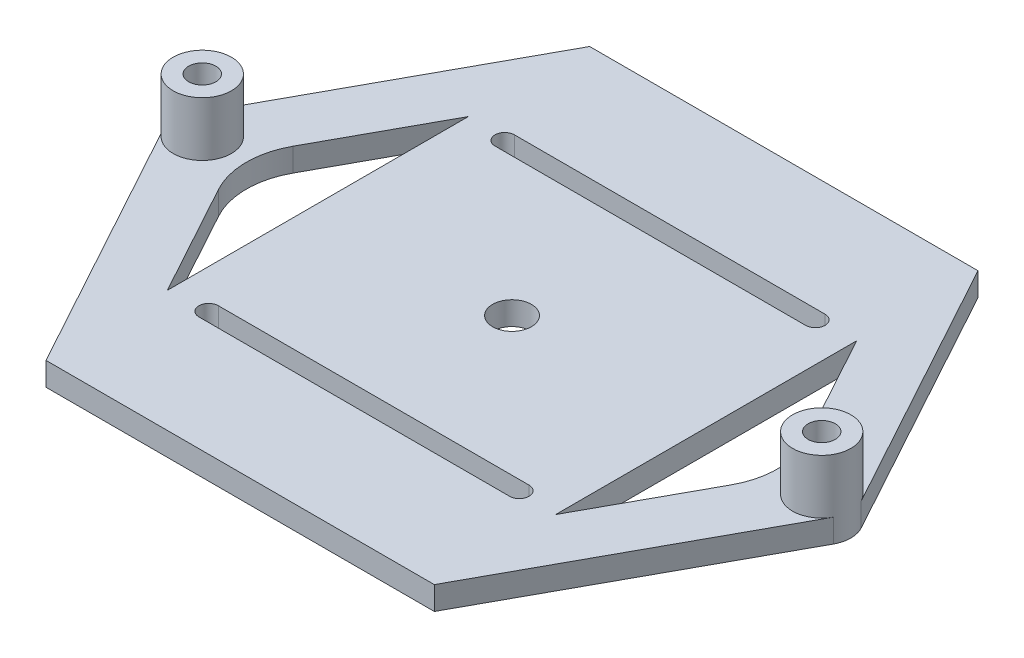
ISO-10303-21;
HEADER;
FILE_DESCRIPTION(('STEP AP214'),'2;1');
FILE_NAME('part.step','',(''),(''),'','','');
FILE_SCHEMA(('AUTOMOTIVE_DESIGN { 1 0 10303 214 1 1 1 1 }'));
ENDSEC;
DATA;
#1=APPLICATION_CONTEXT('core data for automotive mechanical design processes');
#2=APPLICATION_PROTOCOL_DEFINITION('international standard','automotive_design',2000,#1);
#3=PRODUCT_CONTEXT('',#1,'mechanical');
#4=PRODUCT('Part','Part','',(#3));
#5=PRODUCT_RELATED_PRODUCT_CATEGORY('part','',(#4));
#6=PRODUCT_DEFINITION_FORMATION('','',#4);
#7=PRODUCT_DEFINITION_CONTEXT('part definition',#1,'design');
#8=PRODUCT_DEFINITION('design','',#6,#7);
#9=PRODUCT_DEFINITION_SHAPE('','',#8);
#10=(LENGTH_UNIT() NAMED_UNIT(*) SI_UNIT(.MILLI.,.METRE.));
#11=(NAMED_UNIT(*) PLANE_ANGLE_UNIT() SI_UNIT($,.RADIAN.));
#12=(NAMED_UNIT(*) SI_UNIT($,.STERADIAN.) SOLID_ANGLE_UNIT());
#13=UNCERTAINTY_MEASURE_WITH_UNIT(LENGTH_MEASURE(1.E-05),#10,'distance_accuracy_value','');
#14=(GEOMETRIC_REPRESENTATION_CONTEXT(3) GLOBAL_UNCERTAINTY_ASSIGNED_CONTEXT((#13)) GLOBAL_UNIT_ASSIGNED_CONTEXT((#10,
#11,#12)) REPRESENTATION_CONTEXT('',''));
#15=CARTESIAN_POINT('',(0.,0.,0.));
#16=DIRECTION('',(0.,0.,1.));
#17=DIRECTION('',(1.,0.,0.));
#18=AXIS2_PLACEMENT_3D('',#15,#16,#17);
#19=CARTESIAN_POINT('',(-39.8762558433018,-110.2,0.));
#20=DIRECTION('',(0.,1.,0.));
#21=DIRECTION('',(0.,0.,1.));
#22=AXIS2_PLACEMENT_3D('',#19,#20,#21);
#23=CYLINDRICAL_SURFACE('',#22,3.75000000000001);
#24=CARTESIAN_POINT('',(-39.8762558433018,-100.2,0.));
#25=DIRECTION('',(0.,-1.,0.));
#26=DIRECTION('',(0.,0.,-1.));
#27=AXIS2_PLACEMENT_3D('',#24,#25,#26);
#28=CIRCLE('',#27,3.75000000000001);
#29=CARTESIAN_POINT('',(-39.8762558433018,-100.2,-3.75000000000001));
#30=VERTEX_POINT('',#29);
#31=EDGE_CURVE('E49',#30,#30,#28,.T.);
#32=ORIENTED_EDGE('',*,*,#31,.T.);
#33=EDGE_LOOP('',(#32));
#34=FACE_BOUND('',#33,.T.);
#35=DIRECTION('',(0.,-1.,0.));
#36=VECTOR('',#35,1.);
#37=CARTESIAN_POINT('',(-43.1659902962379,-107.2,1.80004089652578));
#38=LINE('',#37,#36);
#39=CARTESIAN_POINT('',(-43.1659902962379,-107.2,1.80004089652578));
#40=VERTEX_POINT('',#39);
#41=CARTESIAN_POINT('',(-43.1659902962379,-110.2,1.80004089652577));
#42=VERTEX_POINT('',#41);
#43=EDGE_CURVE('E466',#40,#42,#38,.T.);
#44=ORIENTED_EDGE('',*,*,#43,.F.);
#45=CARTESIAN_POINT('',(-39.8762558433018,-107.2,0.));
#46=DIRECTION('',(0.,-1.,0.));
#47=DIRECTION('',(0.,0.,-1.));
#48=AXIS2_PLACEMENT_3D('',#45,#46,#47);
#49=CIRCLE('',#48,3.75000000000001);
#50=CARTESIAN_POINT('',(-43.1659902962379,-107.2,-1.80004089652577));
#51=VERTEX_POINT('',#50);
#52=EDGE_CURVE('E356',#51,#40,#49,.T.);
#53=ORIENTED_EDGE('',*,*,#52,.F.);
#54=DIRECTION('',(0.,-1.,0.));
#55=VECTOR('',#54,1.);
#56=CARTESIAN_POINT('',(-43.1659902962379,-107.2,-1.80004089652577));
#57=LINE('',#56,#55);
#58=CARTESIAN_POINT('',(-43.1659902962379,-110.2,-1.80004089652577));
#59=VERTEX_POINT('',#58);
#60=EDGE_CURVE('E463',#51,#59,#57,.T.);
#61=ORIENTED_EDGE('',*,*,#60,.T.);
#62=CARTESIAN_POINT('',(-39.8762558433018,-110.2,0.));
#63=DIRECTION('',(0.,-1.,0.));
#64=DIRECTION('',(0.,0.,-1.));
#65=AXIS2_PLACEMENT_3D('',#62,#63,#64);
#66=CIRCLE('',#65,3.75000000000001);
#67=EDGE_CURVE('E11',#42,#59,#66,.T.);
#68=ORIENTED_EDGE('',*,*,#67,.F.);
#69=EDGE_LOOP('',(#44,#53,#61,#68));
#70=FACE_BOUND('',#69,.T.);
#71=ADVANCED_FACE('F50',(#34,#70),#23,.T.);
#72=CARTESIAN_POINT('',(-39.8762558433018,-110.2,0.));
#73=DIRECTION('',(0.,-1.,0.));
#74=DIRECTION('',(0.,0.,-1.));
#75=AXIS2_PLACEMENT_3D('',#72,#73,#74);
#76=PLANE('',#75);
#77=CARTESIAN_POINT('',(20.,-110.2,-19.0579297849978));
#78=DIRECTION('',(0.,1.,0.));
#79=DIRECTION('',(0.,0.,-1.));
#80=AXIS2_PLACEMENT_3D('',#77,#78,#79);
#81=CIRCLE('',#80,1.25);
#82=CARTESIAN_POINT('',(20.,-110.2,-17.8079297849977));
#83=VERTEX_POINT('',#82);
#84=CARTESIAN_POINT('',(20.,-110.2,-20.3079297849978));
#85=VERTEX_POINT('',#84);
#86=EDGE_CURVE('E215',#83,#85,#81,.T.);
#87=ORIENTED_EDGE('',*,*,#86,.T.);
#88=DIRECTION('',(-1.,0.,0.));
#89=VECTOR('',#88,1.);
#90=CARTESIAN_POINT('',(20.,-110.2,-20.3079297849978));
#91=LINE('',#90,#89);
#92=CARTESIAN_POINT('',(-20.,-110.2,-20.3079297849978));
#93=VERTEX_POINT('',#92);
#94=EDGE_CURVE('E221',#85,#93,#91,.T.);
#95=ORIENTED_EDGE('',*,*,#94,.T.);
#96=CARTESIAN_POINT('',(-20.,-110.2,-19.0579297849978));
#97=DIRECTION('',(0.,1.,0.));
#98=DIRECTION('',(0.,0.,1.));
#99=AXIS2_PLACEMENT_3D('',#96,#97,#98);
#100=CIRCLE('',#99,1.25);
#101=CARTESIAN_POINT('',(-20.,-110.2,-17.8079297849978));
#102=VERTEX_POINT('',#101);
#103=EDGE_CURVE('E65',#93,#102,#100,.T.);
#104=ORIENTED_EDGE('',*,*,#103,.T.);
#105=DIRECTION('',(1.,0.,0.));
#106=VECTOR('',#105,1.);
#107=CARTESIAN_POINT('',(20.,-110.2,-17.8079297849977));
#108=LINE('',#107,#106);
#109=EDGE_CURVE('E222',#102,#83,#108,.T.);
#110=ORIENTED_EDGE('',*,*,#109,.T.);
#111=EDGE_LOOP('',(#87,#95,#104,#110));
#112=FACE_BOUND('',#111,.T.);
#113=CARTESIAN_POINT('',(20.,-110.2,19.0579297849978));
#114=DIRECTION('',(0.,1.,0.));
#115=DIRECTION('',(0.,0.,1.));
#116=AXIS2_PLACEMENT_3D('',#113,#114,#115);
#117=CIRCLE('',#116,1.25);
#118=CARTESIAN_POINT('',(20.,-110.2,20.3079297849978));
#119=VERTEX_POINT('',#118);
#120=CARTESIAN_POINT('',(20.,-110.2,17.8079297849978));
#121=VERTEX_POINT('',#120);
#122=EDGE_CURVE('E282',#119,#121,#117,.T.);
#123=ORIENTED_EDGE('',*,*,#122,.T.);
#124=DIRECTION('',(-1.,0.,0.));
#125=VECTOR('',#124,1.);
#126=CARTESIAN_POINT('',(20.,-110.2,17.8079297849978));
#127=LINE('',#126,#125);
#128=CARTESIAN_POINT('',(-20.,-110.2,17.8079297849978));
#129=VERTEX_POINT('',#128);
#130=EDGE_CURVE('E297',#121,#129,#127,.T.);
#131=ORIENTED_EDGE('',*,*,#130,.T.);
#132=CARTESIAN_POINT('',(-20.,-110.2,19.0579297849978));
#133=DIRECTION('',(0.,1.,0.));
#134=DIRECTION('',(0.,0.,-1.));
#135=AXIS2_PLACEMENT_3D('',#132,#133,#134);
#136=CIRCLE('',#135,1.25);
#137=CARTESIAN_POINT('',(-20.,-110.2,20.3079297849978));
#138=VERTEX_POINT('',#137);
#139=EDGE_CURVE('E69',#129,#138,#136,.T.);
#140=ORIENTED_EDGE('',*,*,#139,.T.);
#141=DIRECTION('',(1.,0.,0.));
#142=VECTOR('',#141,1.);
#143=CARTESIAN_POINT('',(20.,-110.2,20.3079297849978));
#144=LINE('',#143,#142);
#145=EDGE_CURVE('E266',#138,#119,#144,.T.);
#146=ORIENTED_EDGE('',*,*,#145,.T.);
#147=EDGE_LOOP('',(#123,#131,#140,#146));
#148=FACE_BOUND('',#147,.T.);
#149=CARTESIAN_POINT('',(0.,-110.2,0.));
#150=DIRECTION('',(0.,1.,0.));
#151=DIRECTION('',(0.,0.,1.));
#152=AXIS2_PLACEMENT_3D('',#149,#150,#151);
#153=CIRCLE('',#152,2.5);
#154=CARTESIAN_POINT('',(0.,-110.2,2.50000000000001));
#155=VERTEX_POINT('',#154);
#156=EDGE_CURVE('E301',#155,#155,#153,.T.);
#157=ORIENTED_EDGE('',*,*,#156,.T.);
#158=EDGE_LOOP('',(#157));
#159=FACE_BOUND('',#158,.T.);
#160=ORIENTED_EDGE('',*,*,#67,.T.);
#161=DIRECTION('',(-0.480010905740205,0.,0.877262520782957));
#162=VECTOR('',#161,1.);
#163=CARTESIAN_POINT('',(-33.9780834603154,-110.2,-18.5917558663577));
#164=LINE('',#163,#162);
#165=CARTESIAN_POINT('',(-25.,-110.2,-35.));
#166=VERTEX_POINT('',#165);
#167=EDGE_CURVE('E414',#166,#59,#164,.T.);
#168=ORIENTED_EDGE('',*,*,#167,.F.);
#169=DIRECTION('',(-1.,0.,0.));
#170=VECTOR('',#169,1.);
#171=CARTESIAN_POINT('',(0.,-110.2,-35.));
#172=LINE('',#171,#170);
#173=CARTESIAN_POINT('',(25.,-110.2,-35.));
#174=VERTEX_POINT('',#173);
#175=EDGE_CURVE('E420',#174,#166,#172,.T.);
#176=ORIENTED_EDGE('',*,*,#175,.F.);
#177=DIRECTION('',(0.480010905740205,0.,0.877262520782957));
#178=VECTOR('',#177,1.);
#179=CARTESIAN_POINT('',(33.9780834603154,-110.2,-18.5917558663577));
#180=LINE('',#179,#178);
#181=CARTESIAN_POINT('',(43.1659902962396,-110.2,-1.80004089652668));
#182=VERTEX_POINT('',#181);
#183=EDGE_CURVE('E425',#174,#182,#180,.T.);
#184=ORIENTED_EDGE('',*,*,#183,.T.);
#185=CARTESIAN_POINT('',(39.8762558433018,-110.2,0.));
#186=DIRECTION('',(0.,-1.,0.));
#187=DIRECTION('',(0.,0.,1.));
#188=AXIS2_PLACEMENT_3D('',#185,#186,#187);
#189=CIRCLE('',#188,3.75000000000192);
#190=CARTESIAN_POINT('',(43.1659902962396,-110.2,1.8000408965267));
#191=VERTEX_POINT('',#190);
#192=EDGE_CURVE('E307',#182,#191,#189,.T.);
#193=ORIENTED_EDGE('',*,*,#192,.T.);
#194=DIRECTION('',(0.480010905740205,0.,-0.877262520782957));
#195=VECTOR('',#194,1.);
#196=CARTESIAN_POINT('',(33.9780834603154,-110.2,18.5917558663577));
#197=LINE('',#196,#195);
#198=CARTESIAN_POINT('',(25.,-110.2,35.));
#199=VERTEX_POINT('',#198);
#200=EDGE_CURVE('E401',#199,#191,#197,.T.);
#201=ORIENTED_EDGE('',*,*,#200,.F.);
#202=DIRECTION('',(-1.,0.,0.));
#203=VECTOR('',#202,1.);
#204=CARTESIAN_POINT('',(0.,-110.2,35.));
#205=LINE('',#204,#203);
#206=CARTESIAN_POINT('',(-25.,-110.2,35.));
#207=VERTEX_POINT('',#206);
#208=EDGE_CURVE('E410',#199,#207,#205,.T.);
#209=ORIENTED_EDGE('',*,*,#208,.T.);
#210=DIRECTION('',(-0.480010905740205,0.,-0.877262520782957));
#211=VECTOR('',#210,1.);
#212=CARTESIAN_POINT('',(-33.9780834603154,-110.2,18.5917558663577));
#213=LINE('',#212,#211);
#214=EDGE_CURVE('E413',#207,#42,#213,.T.);
#215=ORIENTED_EDGE('',*,*,#214,.T.);
#216=EDGE_LOOP('',(#160,#168,#176,#184,#193,#201,#209,#215));
#217=FACE_BOUND('',#216,.T.);
#218=CARTESIAN_POINT('',(-39.8762558433018,-110.2,0.));
#219=DIRECTION('',(0.,-1.,0.));
#220=DIRECTION('',(0.,0.,-1.));
#221=AXIS2_PLACEMENT_3D('',#218,#219,#220);
#222=CIRCLE('',#221,1.75);
#223=CARTESIAN_POINT('',(-39.8762558433018,-110.2,-1.75));
#224=VERTEX_POINT('',#223);
#225=EDGE_CURVE('E493',#224,#224,#222,.T.);
#226=ORIENTED_EDGE('',*,*,#225,.F.);
#227=EDGE_LOOP('',(#226));
#228=FACE_BOUND('',#227,.T.);
#229=CARTESIAN_POINT('',(-24.202498359934,-110.2,0.));
#230=DIRECTION('',(0.,-1.,0.));
#231=DIRECTION('',(0.,0.,-1.));
#232=AXIS2_PLACEMENT_3D('',#229,#230,#231);
#233=CIRCLE('',#232,10.);
#234=CARTESIAN_POINT('',(-32.9751235677635,-110.2,4.80010905740209));
#235=VERTEX_POINT('',#234);
#236=CARTESIAN_POINT('',(-32.9751235677635,-110.2,-4.80010905740209));
#237=VERTEX_POINT('',#236);
#238=EDGE_CURVE('E323',#235,#237,#233,.T.);
#239=ORIENTED_EDGE('',*,*,#238,.F.);
#240=DIRECTION('',(0.480010905740205,0.,0.877262520782957));
#241=VECTOR('',#240,1.);
#242=CARTESIAN_POINT('',(-27.3986145544432,-110.2,14.9916740733061));
#243=LINE('',#242,#241);
#244=CARTESIAN_POINT('',(-25.,-110.2,19.3753549964983));
#245=VERTEX_POINT('',#244);
#246=EDGE_CURVE('E395',#235,#245,#243,.T.);
#247=ORIENTED_EDGE('',*,*,#246,.T.);
#248=DIRECTION('',(0.,0.,1.));
#249=VECTOR('',#248,1.);
#250=CARTESIAN_POINT('',(-25.,-110.2,0.));
#251=LINE('',#250,#249);
#252=CARTESIAN_POINT('',(-25.,-110.2,-19.3753549964983));
#253=VERTEX_POINT('',#252);
#254=EDGE_CURVE('E398',#253,#245,#251,.T.);
#255=ORIENTED_EDGE('',*,*,#254,.F.);
#256=DIRECTION('',(0.480010905740205,0.,-0.877262520782957));
#257=VECTOR('',#256,1.);
#258=CARTESIAN_POINT('',(-27.3986145544432,-110.2,-14.9916740733061));
#259=LINE('',#258,#257);
#260=EDGE_CURVE('E399',#237,#253,#259,.T.);
#261=ORIENTED_EDGE('',*,*,#260,.F.);
#262=EDGE_LOOP('',(#239,#247,#255,#261));
#263=FACE_BOUND('',#262,.T.);
#264=DIRECTION('',(-0.480010905740205,0.,0.877262520782957));
#265=VECTOR('',#264,1.);
#266=CARTESIAN_POINT('',(27.3986145544432,-110.2,14.9916740733061));
#267=LINE('',#266,#265);
#268=CARTESIAN_POINT('',(32.9751235677635,-110.2,4.80010905740209));
#269=VERTEX_POINT('',#268);
#270=CARTESIAN_POINT('',(25.,-110.2,19.3753549964983));
#271=VERTEX_POINT('',#270);
#272=EDGE_CURVE('E426',#269,#271,#267,.T.);
#273=ORIENTED_EDGE('',*,*,#272,.F.);
#274=CARTESIAN_POINT('',(24.202498359934,-110.2,0.));
#275=DIRECTION('',(0.,-1.,0.));
#276=DIRECTION('',(0.,0.,-1.));
#277=AXIS2_PLACEMENT_3D('',#274,#275,#276);
#278=CIRCLE('',#277,10.);
#279=CARTESIAN_POINT('',(32.9751235677635,-110.2,-4.80010905740209));
#280=VERTEX_POINT('',#279);
#281=EDGE_CURVE('E429',#269,#280,#278,.F.);
#282=ORIENTED_EDGE('',*,*,#281,.T.);
#283=DIRECTION('',(-0.480010905740205,0.,-0.877262520782957));
#284=VECTOR('',#283,1.);
#285=CARTESIAN_POINT('',(27.3986145544432,-110.2,-14.9916740733061));
#286=LINE('',#285,#284);
#287=CARTESIAN_POINT('',(25.,-110.2,-19.3753549964983));
#288=VERTEX_POINT('',#287);
#289=EDGE_CURVE('E432',#280,#288,#286,.T.);
#290=ORIENTED_EDGE('',*,*,#289,.T.);
#291=DIRECTION('',(0.,0.,1.));
#292=VECTOR('',#291,1.);
#293=CARTESIAN_POINT('',(25.,-110.2,0.));
#294=LINE('',#293,#292);
#295=EDGE_CURVE('E335',#288,#271,#294,.T.);
#296=ORIENTED_EDGE('',*,*,#295,.T.);
#297=EDGE_LOOP('',(#273,#282,#290,#296));
#298=FACE_BOUND('',#297,.T.);
#299=CARTESIAN_POINT('',(39.8762558433018,-110.2,0.));
#300=DIRECTION('',(0.,-1.,0.));
#301=DIRECTION('',(0.,0.,1.));
#302=AXIS2_PLACEMENT_3D('',#299,#300,#301);
#303=CIRCLE('',#302,1.75000000000191);
#304=CARTESIAN_POINT('',(39.8762558433018,-110.2,1.75000000000193));
#305=VERTEX_POINT('',#304);
#306=EDGE_CURVE('E312',#305,#305,#303,.T.);
#307=ORIENTED_EDGE('',*,*,#306,.F.);
#308=EDGE_LOOP('',(#307));
#309=FACE_BOUND('',#308,.T.);
#310=ADVANCED_FACE('F226',(#112,#148,#159,#217,#228,#263,#298,#309),#76,.T.);
#311=CARTESIAN_POINT('',(-39.8762558433018,-100.2,0.));
#312=DIRECTION('',(0.,-1.,0.));
#313=DIRECTION('',(0.,0.,-1.));
#314=AXIS2_PLACEMENT_3D('',#311,#312,#313);
#315=PLANE('',#314);
#316=ORIENTED_EDGE('',*,*,#31,.F.);
#317=EDGE_LOOP('',(#316));
#318=FACE_BOUND('',#317,.T.);
#319=CARTESIAN_POINT('',(-39.8762558433018,-100.2,0.));
#320=DIRECTION('',(0.,-1.,0.));
#321=DIRECTION('',(0.,0.,-1.));
#322=AXIS2_PLACEMENT_3D('',#319,#320,#321);
#323=CIRCLE('',#322,1.75);
#324=CARTESIAN_POINT('',(-39.8762558433018,-100.2,-1.75));
#325=VERTEX_POINT('',#324);
#326=EDGE_CURVE('E441',#325,#325,#323,.T.);
#327=ORIENTED_EDGE('',*,*,#326,.T.);
#328=EDGE_LOOP('',(#327));
#329=FACE_BOUND('',#328,.T.);
#330=ADVANCED_FACE('F505',(#318,#329),#315,.F.);
#331=CARTESIAN_POINT('',(-39.8762558433018,-110.2,0.));
#332=DIRECTION('',(0.,1.,0.));
#333=DIRECTION('',(0.,0.,1.));
#334=AXIS2_PLACEMENT_3D('',#331,#332,#333);
#335=CYLINDRICAL_SURFACE('',#334,1.75);
#336=ORIENTED_EDGE('',*,*,#225,.T.);
#337=EDGE_LOOP('',(#336));
#338=FACE_BOUND('',#337,.T.);
#339=ORIENTED_EDGE('',*,*,#326,.F.);
#340=EDGE_LOOP('',(#339));
#341=FACE_BOUND('',#340,.T.);
#342=ADVANCED_FACE('F501',(#338,#341),#335,.F.);
#343=CARTESIAN_POINT('',(27.3986145544432,-107.2,14.9916740733061));
#344=DIRECTION('',(0.877262520782957,0.,0.480010905740205));
#345=DIRECTION('',(0.480010905740205,0.,-0.877262520782957));
#346=AXIS2_PLACEMENT_3D('',#343,#344,#345);
#347=PLANE('',#346);
#348=ORIENTED_EDGE('',*,*,#272,.T.);
#349=DIRECTION('',(0.,-1.,0.));
#350=VECTOR('',#349,1.);
#351=CARTESIAN_POINT('',(25.,-107.2,19.3753549964983));
#352=LINE('',#351,#350);
#353=CARTESIAN_POINT('',(25.,-107.2,19.3753549964983));
#354=VERTEX_POINT('',#353);
#355=EDGE_CURVE('E442',#354,#271,#352,.T.);
#356=ORIENTED_EDGE('',*,*,#355,.F.);
#357=DIRECTION('',(-0.480010905740205,0.,0.877262520782957));
#358=VECTOR('',#357,1.);
#359=CARTESIAN_POINT('',(27.3986145544432,-107.2,14.9916740733061));
#360=LINE('',#359,#358);
#361=CARTESIAN_POINT('',(32.9751235677635,-107.2,4.80010905740209));
#362=VERTEX_POINT('',#361);
#363=EDGE_CURVE('E373',#362,#354,#360,.T.);
#364=ORIENTED_EDGE('',*,*,#363,.F.);
#365=DIRECTION('',(0.,-1.,0.));
#366=VECTOR('',#365,1.);
#367=CARTESIAN_POINT('',(32.9751235677635,-107.2,4.80010905740209));
#368=LINE('',#367,#366);
#369=EDGE_CURVE('E453',#362,#269,#368,.T.);
#370=ORIENTED_EDGE('',*,*,#369,.T.);
#371=EDGE_LOOP('',(#348,#356,#364,#370));
#372=FACE_BOUND('',#371,.T.);
#373=ADVANCED_FACE('F508',(#372),#347,.F.);
#374=CARTESIAN_POINT('',(25.,-107.2,0.));
#375=DIRECTION('',(1.,0.,0.));
#376=DIRECTION('',(0.,0.,-1.));
#377=AXIS2_PLACEMENT_3D('',#374,#375,#376);
#378=PLANE('',#377);
#379=ORIENTED_EDGE('',*,*,#295,.F.);
#380=DIRECTION('',(0.,-1.,0.));
#381=VECTOR('',#380,1.);
#382=CARTESIAN_POINT('',(25.,-107.2,-19.3753549964983));
#383=LINE('',#382,#381);
#384=CARTESIAN_POINT('',(25.,-107.2,-19.3753549964983));
#385=VERTEX_POINT('',#384);
#386=EDGE_CURVE('E443',#385,#288,#383,.T.);
#387=ORIENTED_EDGE('',*,*,#386,.F.);
#388=DIRECTION('',(0.,0.,1.));
#389=VECTOR('',#388,1.);
#390=CARTESIAN_POINT('',(25.,-107.2,0.));
#391=LINE('',#390,#389);
#392=EDGE_CURVE('E383',#385,#354,#391,.T.);
#393=ORIENTED_EDGE('',*,*,#392,.T.);
#394=ORIENTED_EDGE('',*,*,#355,.T.);
#395=EDGE_LOOP('',(#379,#387,#393,#394));
#396=FACE_BOUND('',#395,.T.);
#397=ADVANCED_FACE('F514',(#396),#378,.T.);
#398=CARTESIAN_POINT('',(27.3986145544432,-107.2,-14.9916740733061));
#399=DIRECTION('',(-0.877262520782957,0.,0.480010905740205));
#400=DIRECTION('',(0.480010905740205,0.,0.877262520782957));
#401=AXIS2_PLACEMENT_3D('',#398,#399,#400);
#402=PLANE('',#401);
#403=ORIENTED_EDGE('',*,*,#289,.F.);
#404=DIRECTION('',(0.,-1.,0.));
#405=VECTOR('',#404,1.);
#406=CARTESIAN_POINT('',(32.9751235677635,-107.2,-4.80010905740209));
#407=LINE('',#406,#405);
#408=CARTESIAN_POINT('',(32.9751235677635,-107.2,-4.80010905740209));
#409=VERTEX_POINT('',#408);
#410=EDGE_CURVE('E449',#409,#280,#407,.T.);
#411=ORIENTED_EDGE('',*,*,#410,.F.);
#412=DIRECTION('',(-0.480010905740205,0.,-0.877262520782957));
#413=VECTOR('',#412,1.);
#414=CARTESIAN_POINT('',(27.3986145544432,-107.2,-14.9916740733061));
#415=LINE('',#414,#413);
#416=EDGE_CURVE('E379',#409,#385,#415,.T.);
#417=ORIENTED_EDGE('',*,*,#416,.T.);
#418=ORIENTED_EDGE('',*,*,#386,.T.);
#419=EDGE_LOOP('',(#403,#411,#417,#418));
#420=FACE_BOUND('',#419,.T.);
#421=ADVANCED_FACE('F624',(#420),#402,.T.);
#422=CARTESIAN_POINT('',(33.9780834603154,-107.2,-18.5917558663577));
#423=DIRECTION('',(0.877262520782957,0.,-0.480010905740205));
#424=DIRECTION('',(-0.480010905740205,0.,-0.877262520782957));
#425=AXIS2_PLACEMENT_3D('',#422,#423,#424);
#426=PLANE('',#425);
#427=ORIENTED_EDGE('',*,*,#183,.F.);
#428=DIRECTION('',(0.,-1.,0.));
#429=VECTOR('',#428,1.);
#430=CARTESIAN_POINT('',(25.,-107.2,-35.));
#431=LINE('',#430,#429);
#432=CARTESIAN_POINT('',(25.,-107.2,-35.));
#433=VERTEX_POINT('',#432);
#434=EDGE_CURVE('E456',#433,#174,#431,.T.);
#435=ORIENTED_EDGE('',*,*,#434,.F.);
#436=DIRECTION('',(0.480010905740205,0.,0.877262520782957));
#437=VECTOR('',#436,1.);
#438=CARTESIAN_POINT('',(33.9780834603154,-107.2,-18.5917558663577));
#439=LINE('',#438,#437);
#440=CARTESIAN_POINT('',(43.1659902962379,-107.2,-1.80004089652577));
#441=VERTEX_POINT('',#440);
#442=EDGE_CURVE('E369',#433,#441,#439,.T.);
#443=ORIENTED_EDGE('',*,*,#442,.T.);
#444=DIRECTION('',(0.,-1.,0.));
#445=VECTOR('',#444,1.);
#446=CARTESIAN_POINT('',(43.1659902962379,-107.2,-1.80004089652577));
#447=LINE('',#446,#445);
#448=EDGE_CURVE('E452',#441,#182,#447,.T.);
#449=ORIENTED_EDGE('',*,*,#448,.T.);
#450=EDGE_LOOP('',(#427,#435,#443,#449));
#451=FACE_BOUND('',#450,.T.);
#452=ADVANCED_FACE('F553',(#451),#426,.T.);
#453=CARTESIAN_POINT('',(0.,-107.2,-35.));
#454=DIRECTION('',(0.,0.,1.));
#455=DIRECTION('',(1.,0.,0.));
#456=AXIS2_PLACEMENT_3D('',#453,#454,#455);
#457=PLANE('',#456);
#458=ORIENTED_EDGE('',*,*,#175,.T.);
#459=DIRECTION('',(0.,-1.,0.));
#460=VECTOR('',#459,1.);
#461=CARTESIAN_POINT('',(-25.,-107.2,-35.));
#462=LINE('',#461,#460);
#463=CARTESIAN_POINT('',(-25.,-107.2,-35.));
#464=VERTEX_POINT('',#463);
#465=EDGE_CURVE('E462',#464,#166,#462,.T.);
#466=ORIENTED_EDGE('',*,*,#465,.F.);
#467=DIRECTION('',(-1.,0.,0.));
#468=VECTOR('',#467,1.);
#469=CARTESIAN_POINT('',(0.,-107.2,-35.));
#470=LINE('',#469,#468);
#471=EDGE_CURVE('E368',#433,#464,#470,.T.);
#472=ORIENTED_EDGE('',*,*,#471,.F.);
#473=ORIENTED_EDGE('',*,*,#434,.T.);
#474=EDGE_LOOP('',(#458,#466,#472,#473));
#475=FACE_BOUND('',#474,.T.);
#476=ADVANCED_FACE('F556',(#475),#457,.F.);
#477=CARTESIAN_POINT('',(-33.9780834603154,-107.2,-18.5917558663577));
#478=DIRECTION('',(0.877262520782957,0.,0.480010905740205));
#479=DIRECTION('',(0.480010905740205,0.,-0.877262520782957));
#480=AXIS2_PLACEMENT_3D('',#477,#478,#479);
#481=PLANE('',#480);
#482=ORIENTED_EDGE('',*,*,#167,.T.);
#483=ORIENTED_EDGE('',*,*,#60,.F.);
#484=DIRECTION('',(-0.480010905740205,0.,0.877262520782957));
#485=VECTOR('',#484,1.);
#486=CARTESIAN_POINT('',(-33.9780834603154,-107.2,-18.5917558663577));
#487=LINE('',#486,#485);
#488=EDGE_CURVE('E362',#464,#51,#487,.T.);
#489=ORIENTED_EDGE('',*,*,#488,.F.);
#490=ORIENTED_EDGE('',*,*,#465,.T.);
#491=EDGE_LOOP('',(#482,#483,#489,#490));
#492=FACE_BOUND('',#491,.T.);
#493=ADVANCED_FACE('F563',(#492),#481,.F.);
#494=CARTESIAN_POINT('',(-33.9780834603154,-107.2,18.5917558663577));
#495=DIRECTION('',(-0.877262520782957,0.,0.480010905740205));
#496=DIRECTION('',(0.480010905740205,0.,0.877262520782957));
#497=AXIS2_PLACEMENT_3D('',#494,#495,#496);
#498=PLANE('',#497);
#499=ORIENTED_EDGE('',*,*,#214,.F.);
#500=DIRECTION('',(0.,-1.,0.));
#501=VECTOR('',#500,1.);
#502=CARTESIAN_POINT('',(-25.,-107.2,35.));
#503=LINE('',#502,#501);
#504=CARTESIAN_POINT('',(-25.,-107.2,35.));
#505=VERTEX_POINT('',#504);
#506=EDGE_CURVE('E472',#505,#207,#503,.T.);
#507=ORIENTED_EDGE('',*,*,#506,.F.);
#508=DIRECTION('',(-0.480010905740205,0.,-0.877262520782957));
#509=VECTOR('',#508,1.);
#510=CARTESIAN_POINT('',(-33.9780834603154,-107.2,18.5917558663577));
#511=LINE('',#510,#509);
#512=EDGE_CURVE('E351',#505,#40,#511,.T.);
#513=ORIENTED_EDGE('',*,*,#512,.T.);
#514=ORIENTED_EDGE('',*,*,#43,.T.);
#515=EDGE_LOOP('',(#499,#507,#513,#514));
#516=FACE_BOUND('',#515,.T.);
#517=ADVANCED_FACE('F536',(#516),#498,.T.);
#518=CARTESIAN_POINT('',(0.,-107.2,35.));
#519=DIRECTION('',(0.,0.,1.));
#520=DIRECTION('',(1.,0.,0.));
#521=AXIS2_PLACEMENT_3D('',#518,#519,#520);
#522=PLANE('',#521);
#523=ORIENTED_EDGE('',*,*,#208,.F.);
#524=DIRECTION('',(0.,-1.,0.));
#525=VECTOR('',#524,1.);
#526=CARTESIAN_POINT('',(25.,-107.2,35.));
#527=LINE('',#526,#525);
#528=CARTESIAN_POINT('',(25.,-107.2,35.));
#529=VERTEX_POINT('',#528);
#530=EDGE_CURVE('E474',#529,#199,#527,.T.);
#531=ORIENTED_EDGE('',*,*,#530,.F.);
#532=DIRECTION('',(-1.,0.,0.));
#533=VECTOR('',#532,1.);
#534=CARTESIAN_POINT('',(0.,-107.2,35.));
#535=LINE('',#534,#533);
#536=EDGE_CURVE('E348',#529,#505,#535,.T.);
#537=ORIENTED_EDGE('',*,*,#536,.T.);
#538=ORIENTED_EDGE('',*,*,#506,.T.);
#539=EDGE_LOOP('',(#523,#531,#537,#538));
#540=FACE_BOUND('',#539,.T.);
#541=ADVANCED_FACE('F537',(#540),#522,.T.);
#542=CARTESIAN_POINT('',(-24.202498359934,-107.2,0.));
#543=DIRECTION('',(0.,-1.,0.));
#544=DIRECTION('',(0.,0.,-1.));
#545=AXIS2_PLACEMENT_3D('',#542,#543,#544);
#546=CYLINDRICAL_SURFACE('',#545,10.);
#547=ORIENTED_EDGE('',*,*,#238,.T.);
#548=DIRECTION('',(0.,-1.,0.));
#549=VECTOR('',#548,1.);
#550=CARTESIAN_POINT('',(-32.9751235677635,-107.2,-4.80010905740209));
#551=LINE('',#550,#549);
#552=CARTESIAN_POINT('',(-32.9751235677635,-107.2,-4.80010905740209));
#553=VERTEX_POINT('',#552);
#554=EDGE_CURVE('E481',#553,#237,#551,.T.);
#555=ORIENTED_EDGE('',*,*,#554,.F.);
#556=CARTESIAN_POINT('',(-24.202498359934,-107.2,0.));
#557=DIRECTION('',(0.,-1.,0.));
#558=DIRECTION('',(0.,0.,-1.));
#559=AXIS2_PLACEMENT_3D('',#556,#557,#558);
#560=CIRCLE('',#559,10.);
#561=CARTESIAN_POINT('',(-32.9751235677635,-107.2,4.80010905740209));
#562=VERTEX_POINT('',#561);
#563=EDGE_CURVE('E330',#562,#553,#560,.T.);
#564=ORIENTED_EDGE('',*,*,#563,.F.);
#565=DIRECTION('',(0.,-1.,0.));
#566=VECTOR('',#565,1.);
#567=CARTESIAN_POINT('',(-32.9751235677635,-107.2,4.80010905740209));
#568=LINE('',#567,#566);
#569=EDGE_CURVE('E389',#562,#235,#568,.T.);
#570=ORIENTED_EDGE('',*,*,#569,.T.);
#571=EDGE_LOOP('',(#547,#555,#564,#570));
#572=FACE_BOUND('',#571,.T.);
#573=ADVANCED_FACE('F571',(#572),#546,.F.);
#574=CARTESIAN_POINT('',(-27.3986145544432,-107.2,-14.9916740733061));
#575=DIRECTION('',(-0.877262520782957,0.,-0.480010905740205));
#576=DIRECTION('',(-0.480010905740205,0.,0.877262520782957));
#577=AXIS2_PLACEMENT_3D('',#574,#575,#576);
#578=PLANE('',#577);
#579=ORIENTED_EDGE('',*,*,#260,.T.);
#580=DIRECTION('',(0.,-1.,0.));
#581=VECTOR('',#580,1.);
#582=CARTESIAN_POINT('',(-25.,-107.2,-19.3753549964983));
#583=LINE('',#582,#581);
#584=CARTESIAN_POINT('',(-25.,-107.2,-19.3753549964983));
#585=VERTEX_POINT('',#584);
#586=EDGE_CURVE('E484',#585,#253,#583,.T.);
#587=ORIENTED_EDGE('',*,*,#586,.F.);
#588=DIRECTION('',(0.480010905740205,0.,-0.877262520782957));
#589=VECTOR('',#588,1.);
#590=CARTESIAN_POINT('',(-27.3986145544432,-107.2,-14.9916740733061));
#591=LINE('',#590,#589);
#592=EDGE_CURVE('E336',#553,#585,#591,.T.);
#593=ORIENTED_EDGE('',*,*,#592,.F.);
#594=ORIENTED_EDGE('',*,*,#554,.T.);
#595=EDGE_LOOP('',(#579,#587,#593,#594));
#596=FACE_BOUND('',#595,.T.);
#597=ADVANCED_FACE('F577',(#596),#578,.F.);
#598=CARTESIAN_POINT('',(-25.,-107.2,0.));
#599=DIRECTION('',(1.,0.,0.));
#600=DIRECTION('',(0.,0.,-1.));
#601=AXIS2_PLACEMENT_3D('',#598,#599,#600);
#602=PLANE('',#601);
#603=ORIENTED_EDGE('',*,*,#254,.T.);
#604=DIRECTION('',(0.,-1.,0.));
#605=VECTOR('',#604,1.);
#606=CARTESIAN_POINT('',(-25.,-107.2,19.3753549964983));
#607=LINE('',#606,#605);
#608=CARTESIAN_POINT('',(-25.,-107.2,19.3753549964983));
#609=VERTEX_POINT('',#608);
#610=EDGE_CURVE('E487',#609,#245,#607,.T.);
#611=ORIENTED_EDGE('',*,*,#610,.F.);
#612=DIRECTION('',(0.,0.,1.));
#613=VECTOR('',#612,1.);
#614=CARTESIAN_POINT('',(-25.,-107.2,0.));
#615=LINE('',#614,#613);
#616=EDGE_CURVE('E337',#585,#609,#615,.T.);
#617=ORIENTED_EDGE('',*,*,#616,.F.);
#618=ORIENTED_EDGE('',*,*,#586,.T.);
#619=EDGE_LOOP('',(#603,#611,#617,#618));
#620=FACE_BOUND('',#619,.T.);
#621=ADVANCED_FACE('F576',(#620),#602,.F.);
#622=CARTESIAN_POINT('',(33.9780834603154,-107.2,18.5917558663577));
#623=DIRECTION('',(-0.877262520782957,0.,-0.480010905740205));
#624=DIRECTION('',(-0.480010905740205,0.,0.877262520782957));
#625=AXIS2_PLACEMENT_3D('',#622,#623,#624);
#626=PLANE('',#625);
#627=ORIENTED_EDGE('',*,*,#200,.T.);
#628=DIRECTION('',(0.,-1.,0.));
#629=VECTOR('',#628,1.);
#630=CARTESIAN_POINT('',(43.1659902962379,-107.2,1.80004089652577));
#631=LINE('',#630,#629);
#632=CARTESIAN_POINT('',(43.1659902962396,-107.2,1.8000408965267));
#633=VERTEX_POINT('',#632);
#634=EDGE_CURVE('E476',#633,#191,#631,.T.);
#635=ORIENTED_EDGE('',*,*,#634,.F.);
#636=DIRECTION('',(0.480010905740205,0.,-0.877262520782957));
#637=VECTOR('',#636,1.);
#638=CARTESIAN_POINT('',(33.9780834603154,-107.2,18.5917558663577));
#639=LINE('',#638,#637);
#640=EDGE_CURVE('E347',#529,#633,#639,.T.);
#641=ORIENTED_EDGE('',*,*,#640,.F.);
#642=ORIENTED_EDGE('',*,*,#530,.T.);
#643=EDGE_LOOP('',(#627,#635,#641,#642));
#644=FACE_BOUND('',#643,.T.);
#645=ADVANCED_FACE('F542',(#644),#626,.F.);
#646=CARTESIAN_POINT('',(-27.3986145544432,-107.2,14.9916740733061));
#647=DIRECTION('',(0.877262520782957,0.,-0.480010905740205));
#648=DIRECTION('',(-0.480010905740205,0.,-0.877262520782957));
#649=AXIS2_PLACEMENT_3D('',#646,#647,#648);
#650=PLANE('',#649);
#651=ORIENTED_EDGE('',*,*,#246,.F.);
#652=ORIENTED_EDGE('',*,*,#569,.F.);
#653=DIRECTION('',(0.480010905740205,0.,0.877262520782957));
#654=VECTOR('',#653,1.);
#655=CARTESIAN_POINT('',(-27.3986145544432,-107.2,14.9916740733061));
#656=LINE('',#655,#654);
#657=EDGE_CURVE('E332',#562,#609,#656,.T.);
#658=ORIENTED_EDGE('',*,*,#657,.T.);
#659=ORIENTED_EDGE('',*,*,#610,.T.);
#660=EDGE_LOOP('',(#651,#652,#658,#659));
#661=FACE_BOUND('',#660,.T.);
#662=ADVANCED_FACE('F580',(#661),#650,.T.);
#663=CARTESIAN_POINT('',(24.202498359934,-107.2,0.));
#664=DIRECTION('',(0.,-1.,0.));
#665=DIRECTION('',(0.,0.,-1.));
#666=AXIS2_PLACEMENT_3D('',#663,#664,#665);
#667=CYLINDRICAL_SURFACE('',#666,10.);
#668=ORIENTED_EDGE('',*,*,#281,.F.);
#669=ORIENTED_EDGE('',*,*,#369,.F.);
#670=CARTESIAN_POINT('',(24.202498359934,-107.2,0.));
#671=DIRECTION('',(0.,-1.,0.));
#672=DIRECTION('',(0.,0.,-1.));
#673=AXIS2_PLACEMENT_3D('',#670,#671,#672);
#674=CIRCLE('',#673,10.);
#675=EDGE_CURVE('E376',#362,#409,#674,.F.);
#676=ORIENTED_EDGE('',*,*,#675,.T.);
#677=ORIENTED_EDGE('',*,*,#410,.T.);
#678=EDGE_LOOP('',(#668,#669,#676,#677));
#679=FACE_BOUND('',#678,.T.);
#680=ADVANCED_FACE('F590',(#679),#667,.F.);
#681=CARTESIAN_POINT('',(0.,-107.2,0.));
#682=DIRECTION('',(0.,-1.,0.));
#683=DIRECTION('',(0.,0.,-1.));
#684=AXIS2_PLACEMENT_3D('',#681,#682,#683);
#685=PLANE('',#684);
#686=DIRECTION('',(-1.,0.,0.));
#687=VECTOR('',#686,1.);
#688=CARTESIAN_POINT('',(20.,-107.2,-20.3079297849978));
#689=LINE('',#688,#687);
#690=CARTESIAN_POINT('',(20.,-107.2,-20.3079297849978));
#691=VERTEX_POINT('',#690);
#692=CARTESIAN_POINT('',(-20.,-107.2,-20.3079297849978));
#693=VERTEX_POINT('',#692);
#694=EDGE_CURVE('E248',#691,#693,#689,.T.);
#695=ORIENTED_EDGE('',*,*,#694,.F.);
#696=CARTESIAN_POINT('',(20.,-107.2,-19.0579297849978));
#697=DIRECTION('',(0.,1.,0.));
#698=DIRECTION('',(0.,0.,-1.));
#699=AXIS2_PLACEMENT_3D('',#696,#697,#698);
#700=CIRCLE('',#699,1.25);
#701=CARTESIAN_POINT('',(20.,-107.2,-17.8079297849977));
#702=VERTEX_POINT('',#701);
#703=EDGE_CURVE('E214',#702,#691,#700,.T.);
#704=ORIENTED_EDGE('',*,*,#703,.F.);
#705=DIRECTION('',(1.,0.,0.));
#706=VECTOR('',#705,1.);
#707=CARTESIAN_POINT('',(20.,-107.2,-17.8079297849977));
#708=LINE('',#707,#706);
#709=CARTESIAN_POINT('',(-20.,-107.2,-17.8079297849978));
#710=VERTEX_POINT('',#709);
#711=EDGE_CURVE('E231',#710,#702,#708,.T.);
#712=ORIENTED_EDGE('',*,*,#711,.F.);
#713=CARTESIAN_POINT('',(-20.,-107.2,-19.0579297849978));
#714=DIRECTION('',(0.,1.,0.));
#715=DIRECTION('',(0.,0.,1.));
#716=AXIS2_PLACEMENT_3D('',#713,#714,#715);
#717=CIRCLE('',#716,1.25);
#718=EDGE_CURVE('E240',#693,#710,#717,.T.);
#719=ORIENTED_EDGE('',*,*,#718,.F.);
#720=EDGE_LOOP('',(#695,#704,#712,#719));
#721=FACE_BOUND('',#720,.T.);
#722=DIRECTION('',(-1.,0.,0.));
#723=VECTOR('',#722,1.);
#724=CARTESIAN_POINT('',(20.,-107.2,17.8079297849978));
#725=LINE('',#724,#723);
#726=CARTESIAN_POINT('',(20.,-107.2,17.8079297849978));
#727=VERTEX_POINT('',#726);
#728=CARTESIAN_POINT('',(-20.,-107.2,17.8079297849978));
#729=VERTEX_POINT('',#728);
#730=EDGE_CURVE('E283',#727,#729,#725,.T.);
#731=ORIENTED_EDGE('',*,*,#730,.F.);
#732=CARTESIAN_POINT('',(20.,-107.2,19.0579297849978));
#733=DIRECTION('',(0.,1.,0.));
#734=DIRECTION('',(0.,0.,1.));
#735=AXIS2_PLACEMENT_3D('',#732,#733,#734);
#736=CIRCLE('',#735,1.25);
#737=CARTESIAN_POINT('',(20.,-107.2,20.3079297849978));
#738=VERTEX_POINT('',#737);
#739=EDGE_CURVE('E250',#738,#727,#736,.T.);
#740=ORIENTED_EDGE('',*,*,#739,.F.);
#741=DIRECTION('',(1.,0.,0.));
#742=VECTOR('',#741,1.);
#743=CARTESIAN_POINT('',(20.,-107.2,20.3079297849978));
#744=LINE('',#743,#742);
#745=CARTESIAN_POINT('',(-20.,-107.2,20.3079297849978));
#746=VERTEX_POINT('',#745);
#747=EDGE_CURVE('E277',#746,#738,#744,.T.);
#748=ORIENTED_EDGE('',*,*,#747,.F.);
#749=CARTESIAN_POINT('',(-20.,-107.2,19.0579297849978));
#750=DIRECTION('',(0.,1.,0.));
#751=DIRECTION('',(0.,0.,-1.));
#752=AXIS2_PLACEMENT_3D('',#749,#750,#751);
#753=CIRCLE('',#752,1.25);
#754=EDGE_CURVE('E278',#729,#746,#753,.T.);
#755=ORIENTED_EDGE('',*,*,#754,.F.);
#756=EDGE_LOOP('',(#731,#740,#748,#755));
#757=FACE_BOUND('',#756,.T.);
#758=CARTESIAN_POINT('',(0.,-107.2,0.));
#759=DIRECTION('',(0.,1.,0.));
#760=DIRECTION('',(0.,0.,1.));
#761=AXIS2_PLACEMENT_3D('',#758,#759,#760);
#762=CIRCLE('',#761,2.5);
#763=CARTESIAN_POINT('',(0.,-107.2,2.50000000000001));
#764=VERTEX_POINT('',#763);
#765=EDGE_CURVE('E258',#764,#764,#762,.T.);
#766=ORIENTED_EDGE('',*,*,#765,.F.);
#767=EDGE_LOOP('',(#766));
#768=FACE_BOUND('',#767,.T.);
#769=ORIENTED_EDGE('',*,*,#563,.T.);
#770=ORIENTED_EDGE('',*,*,#592,.T.);
#771=ORIENTED_EDGE('',*,*,#616,.T.);
#772=ORIENTED_EDGE('',*,*,#657,.F.);
#773=EDGE_LOOP('',(#769,#770,#771,#772));
#774=FACE_BOUND('',#773,.T.);
#775=CARTESIAN_POINT('',(39.8762558433018,-107.2,0.));
#776=DIRECTION('',(0.,-1.,0.));
#777=DIRECTION('',(0.,0.,-1.));
#778=AXIS2_PLACEMENT_3D('',#775,#776,#777);
#779=CIRCLE('',#778,3.75000000000192);
#780=EDGE_CURVE('E345',#633,#441,#779,.T.);
#781=ORIENTED_EDGE('',*,*,#780,.T.);
#782=ORIENTED_EDGE('',*,*,#442,.F.);
#783=ORIENTED_EDGE('',*,*,#471,.T.);
#784=ORIENTED_EDGE('',*,*,#488,.T.);
#785=ORIENTED_EDGE('',*,*,#52,.T.);
#786=ORIENTED_EDGE('',*,*,#512,.F.);
#787=ORIENTED_EDGE('',*,*,#536,.F.);
#788=ORIENTED_EDGE('',*,*,#640,.T.);
#789=EDGE_LOOP('',(#781,#782,#783,#784,#785,#786,#787,#788));
#790=FACE_BOUND('',#789,.T.);
#791=ORIENTED_EDGE('',*,*,#363,.T.);
#792=ORIENTED_EDGE('',*,*,#392,.F.);
#793=ORIENTED_EDGE('',*,*,#416,.F.);
#794=ORIENTED_EDGE('',*,*,#675,.F.);
#795=EDGE_LOOP('',(#791,#792,#793,#794));
#796=FACE_BOUND('',#795,.T.);
#797=ADVANCED_FACE('F533',(#721,#757,#768,#774,#790,#796),#685,.F.);
#798=CARTESIAN_POINT('',(39.8762558433018,-100.2,0.));
#799=DIRECTION('',(0.,1.,0.));
#800=DIRECTION('',(0.,0.,1.));
#801=AXIS2_PLACEMENT_3D('',#798,#799,#800);
#802=PLANE('',#801);
#803=CARTESIAN_POINT('',(39.8762558433018,-100.2,0.));
#804=DIRECTION('',(0.,-1.,0.));
#805=DIRECTION('',(0.,0.,1.));
#806=AXIS2_PLACEMENT_3D('',#803,#804,#805);
#807=CIRCLE('',#806,3.75000000000192);
#808=CARTESIAN_POINT('',(39.8762558433018,-100.2,3.75000000000193));
#809=VERTEX_POINT('',#808);
#810=EDGE_CURVE('E313',#809,#809,#807,.T.);
#811=ORIENTED_EDGE('',*,*,#810,.F.);
#812=EDGE_LOOP('',(#811));
#813=FACE_BOUND('',#812,.T.);
#814=CARTESIAN_POINT('',(39.8762558433018,-100.2,0.));
#815=DIRECTION('',(0.,-1.,0.));
#816=DIRECTION('',(0.,0.,1.));
#817=AXIS2_PLACEMENT_3D('',#814,#815,#816);
#818=CIRCLE('',#817,1.75000000000191);
#819=CARTESIAN_POINT('',(39.8762558433018,-100.2,1.75000000000193));
#820=VERTEX_POINT('',#819);
#821=EDGE_CURVE('E317',#820,#820,#818,.T.);
#822=ORIENTED_EDGE('',*,*,#821,.T.);
#823=EDGE_LOOP('',(#822));
#824=FACE_BOUND('',#823,.T.);
#825=ADVANCED_FACE('F607',(#813,#824),#802,.T.);
#826=CARTESIAN_POINT('',(39.8762558433018,-110.2,0.));
#827=DIRECTION('',(0.,1.,0.));
#828=DIRECTION('',(0.,0.,1.));
#829=AXIS2_PLACEMENT_3D('',#826,#827,#828);
#830=CYLINDRICAL_SURFACE('',#829,3.75000000000192);
#831=ORIENTED_EDGE('',*,*,#448,.F.);
#832=ORIENTED_EDGE('',*,*,#780,.F.);
#833=ORIENTED_EDGE('',*,*,#634,.T.);
#834=ORIENTED_EDGE('',*,*,#192,.F.);
#835=EDGE_LOOP('',(#831,#832,#833,#834));
#836=FACE_BOUND('',#835,.T.);
#837=ORIENTED_EDGE('',*,*,#810,.T.);
#838=EDGE_LOOP('',(#837));
#839=FACE_BOUND('',#838,.T.);
#840=ADVANCED_FACE('F550',(#836,#839),#830,.T.);
#841=CARTESIAN_POINT('',(39.8762558433018,-110.2,0.));
#842=DIRECTION('',(0.,1.,0.));
#843=DIRECTION('',(0.,0.,1.));
#844=AXIS2_PLACEMENT_3D('',#841,#842,#843);
#845=CYLINDRICAL_SURFACE('',#844,1.75000000000191);
#846=ORIENTED_EDGE('',*,*,#306,.T.);
#847=EDGE_LOOP('',(#846));
#848=FACE_BOUND('',#847,.T.);
#849=ORIENTED_EDGE('',*,*,#821,.F.);
#850=EDGE_LOOP('',(#849));
#851=FACE_BOUND('',#850,.T.);
#852=ADVANCED_FACE('F622',(#848,#851),#845,.F.);
#853=CARTESIAN_POINT('',(0.,-110.2,0.));
#854=DIRECTION('',(0.,1.,0.));
#855=DIRECTION('',(0.,0.,1.));
#856=AXIS2_PLACEMENT_3D('',#853,#854,#855);
#857=CYLINDRICAL_SURFACE('',#856,2.5);
#858=ORIENTED_EDGE('',*,*,#156,.F.);
#859=EDGE_LOOP('',(#858));
#860=FACE_BOUND('',#859,.T.);
#861=ORIENTED_EDGE('',*,*,#765,.T.);
#862=EDGE_LOOP('',(#861));
#863=FACE_BOUND('',#862,.T.);
#864=ADVANCED_FACE('F696',(#860,#863),#857,.F.);
#865=CARTESIAN_POINT('',(20.,-110.2,19.0579297849978));
#866=DIRECTION('',(0.,1.,0.));
#867=DIRECTION('',(0.,0.,1.));
#868=AXIS2_PLACEMENT_3D('',#865,#866,#867);
#869=CYLINDRICAL_SURFACE('',#868,1.25);
#870=ORIENTED_EDGE('',*,*,#739,.T.);
#871=DIRECTION('',(0.,1.,0.));
#872=VECTOR('',#871,1.);
#873=CARTESIAN_POINT('',(20.,-110.2,17.8079297849978));
#874=LINE('',#873,#872);
#875=EDGE_CURVE('E265',#121,#727,#874,.T.);
#876=ORIENTED_EDGE('',*,*,#875,.F.);
#877=ORIENTED_EDGE('',*,*,#122,.F.);
#878=DIRECTION('',(0.,1.,0.));
#879=VECTOR('',#878,1.);
#880=CARTESIAN_POINT('',(20.,-110.2,20.3079297849978));
#881=LINE('',#880,#879);
#882=EDGE_CURVE('E272',#119,#738,#881,.T.);
#883=ORIENTED_EDGE('',*,*,#882,.T.);
#884=EDGE_LOOP('',(#870,#876,#877,#883));
#885=FACE_BOUND('',#884,.T.);
#886=ADVANCED_FACE('F703',(#885),#869,.F.);
#887=CARTESIAN_POINT('',(20.,-110.2,20.3079297849978));
#888=DIRECTION('',(0.,0.,1.));
#889=DIRECTION('',(1.,0.,0.));
#890=AXIS2_PLACEMENT_3D('',#887,#888,#889);
#891=PLANE('',#890);
#892=ORIENTED_EDGE('',*,*,#747,.T.);
#893=ORIENTED_EDGE('',*,*,#882,.F.);
#894=ORIENTED_EDGE('',*,*,#145,.F.);
#895=DIRECTION('',(0.,1.,0.));
#896=VECTOR('',#895,1.);
#897=CARTESIAN_POINT('',(-20.,-110.2,20.3079297849978));
#898=LINE('',#897,#896);
#899=EDGE_CURVE('E269',#138,#746,#898,.T.);
#900=ORIENTED_EDGE('',*,*,#899,.T.);
#901=EDGE_LOOP('',(#892,#893,#894,#900));
#902=FACE_BOUND('',#901,.T.);
#903=ADVANCED_FACE('F712',(#902),#891,.F.);
#904=CARTESIAN_POINT('',(-20.,-110.2,19.0579297849978));
#905=DIRECTION('',(0.,1.,0.));
#906=DIRECTION('',(0.,0.,1.));
#907=AXIS2_PLACEMENT_3D('',#904,#905,#906);
#908=CYLINDRICAL_SURFACE('',#907,1.25);
#909=ORIENTED_EDGE('',*,*,#754,.T.);
#910=ORIENTED_EDGE('',*,*,#899,.F.);
#911=ORIENTED_EDGE('',*,*,#139,.F.);
#912=DIRECTION('',(0.,1.,0.));
#913=VECTOR('',#912,1.);
#914=CARTESIAN_POINT('',(-20.,-110.2,17.8079297849978));
#915=LINE('',#914,#913);
#916=EDGE_CURVE('E270',#129,#729,#915,.T.);
#917=ORIENTED_EDGE('',*,*,#916,.T.);
#918=EDGE_LOOP('',(#909,#910,#911,#917));
#919=FACE_BOUND('',#918,.T.);
#920=ADVANCED_FACE('F724',(#919),#908,.F.);
#921=CARTESIAN_POINT('',(20.,-110.2,17.8079297849978));
#922=DIRECTION('',(0.,0.,-1.));
#923=DIRECTION('',(-1.,0.,0.));
#924=AXIS2_PLACEMENT_3D('',#921,#922,#923);
#925=PLANE('',#924);
#926=ORIENTED_EDGE('',*,*,#730,.T.);
#927=ORIENTED_EDGE('',*,*,#916,.F.);
#928=ORIENTED_EDGE('',*,*,#130,.F.);
#929=ORIENTED_EDGE('',*,*,#875,.T.);
#930=EDGE_LOOP('',(#926,#927,#928,#929));
#931=FACE_BOUND('',#930,.T.);
#932=ADVANCED_FACE('F731',(#931),#925,.F.);
#933=CARTESIAN_POINT('',(20.,-110.2,-19.0579297849978));
#934=DIRECTION('',(0.,1.,0.));
#935=DIRECTION('',(0.,0.,1.));
#936=AXIS2_PLACEMENT_3D('',#933,#934,#935);
#937=CYLINDRICAL_SURFACE('',#936,1.25);
#938=ORIENTED_EDGE('',*,*,#703,.T.);
#939=DIRECTION('',(0.,1.,0.));
#940=VECTOR('',#939,1.);
#941=CARTESIAN_POINT('',(20.,-110.2,-20.3079297849978));
#942=LINE('',#941,#940);
#943=EDGE_CURVE('E208',#85,#691,#942,.T.);
#944=ORIENTED_EDGE('',*,*,#943,.F.);
#945=ORIENTED_EDGE('',*,*,#86,.F.);
#946=DIRECTION('',(0.,1.,0.));
#947=VECTOR('',#946,1.);
#948=CARTESIAN_POINT('',(20.,-110.2,-17.8079297849977));
#949=LINE('',#948,#947);
#950=EDGE_CURVE('E251',#83,#702,#949,.T.);
#951=ORIENTED_EDGE('',*,*,#950,.T.);
#952=EDGE_LOOP('',(#938,#944,#945,#951));
#953=FACE_BOUND('',#952,.T.);
#954=ADVANCED_FACE('F209',(#953),#937,.F.);
#955=CARTESIAN_POINT('',(20.,-110.2,-17.8079297849977));
#956=DIRECTION('',(0.,0.,1.));
#957=DIRECTION('',(1.,0.,0.));
#958=AXIS2_PLACEMENT_3D('',#955,#956,#957);
#959=PLANE('',#958);
#960=ORIENTED_EDGE('',*,*,#711,.T.);
#961=ORIENTED_EDGE('',*,*,#950,.F.);
#962=ORIENTED_EDGE('',*,*,#109,.F.);
#963=DIRECTION('',(0.,1.,0.));
#964=VECTOR('',#963,1.);
#965=CARTESIAN_POINT('',(-20.,-110.2,-17.8079297849978));
#966=LINE('',#965,#964);
#967=EDGE_CURVE('E260',#102,#710,#966,.T.);
#968=ORIENTED_EDGE('',*,*,#967,.T.);
#969=EDGE_LOOP('',(#960,#961,#962,#968));
#970=FACE_BOUND('',#969,.T.);
#971=ADVANCED_FACE('F753',(#970),#959,.F.);
#972=CARTESIAN_POINT('',(-20.,-110.2,-19.0579297849978));
#973=DIRECTION('',(0.,1.,0.));
#974=DIRECTION('',(0.,0.,1.));
#975=AXIS2_PLACEMENT_3D('',#972,#973,#974);
#976=CYLINDRICAL_SURFACE('',#975,1.25);
#977=ORIENTED_EDGE('',*,*,#718,.T.);
#978=ORIENTED_EDGE('',*,*,#967,.F.);
#979=ORIENTED_EDGE('',*,*,#103,.F.);
#980=DIRECTION('',(0.,1.,0.));
#981=VECTOR('',#980,1.);
#982=CARTESIAN_POINT('',(-20.,-110.2,-20.3079297849978));
#983=LINE('',#982,#981);
#984=EDGE_CURVE('E219',#93,#693,#983,.T.);
#985=ORIENTED_EDGE('',*,*,#984,.T.);
#986=EDGE_LOOP('',(#977,#978,#979,#985));
#987=FACE_BOUND('',#986,.T.);
#988=ADVANCED_FACE('F759',(#987),#976,.F.);
#989=CARTESIAN_POINT('',(20.,-110.2,-20.3079297849978));
#990=DIRECTION('',(0.,0.,-1.));
#991=DIRECTION('',(-1.,0.,0.));
#992=AXIS2_PLACEMENT_3D('',#989,#990,#991);
#993=PLANE('',#992);
#994=ORIENTED_EDGE('',*,*,#694,.T.);
#995=ORIENTED_EDGE('',*,*,#984,.F.);
#996=ORIENTED_EDGE('',*,*,#94,.F.);
#997=ORIENTED_EDGE('',*,*,#943,.T.);
#998=EDGE_LOOP('',(#994,#995,#996,#997));
#999=FACE_BOUND('',#998,.T.);
#1000=ADVANCED_FACE('F223',(#999),#993,.F.);
#1001=CLOSED_SHELL('',(#71,#310,#330,#342,#373,#397,#421,#452,#476,#493,#517,#541,#573,#597,
#621,#645,#662,#680,#797,#825,#840,#852,#864,#886,#903,#920,#932,#954,#971,#988,#1000));
#1002=MANIFOLD_SOLID_BREP('B2',#1001);
#1003=ADVANCED_BREP_SHAPE_REPRESENTATION('',(#18,#1002),#14);
#1004=SHAPE_DEFINITION_REPRESENTATION(#9,#1003);
ENDSEC;
END-ISO-10303-21;
